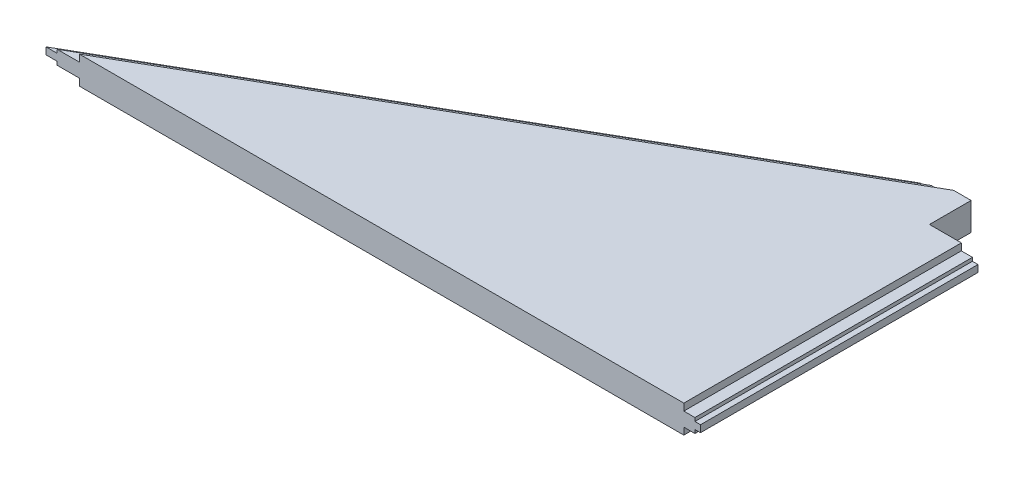
ISO-10303-21;
HEADER;
FILE_DESCRIPTION(('STEP AP214'),'2;1');
FILE_NAME('part.step','',(''),(''),'','','');
FILE_SCHEMA(('AUTOMOTIVE_DESIGN { 1 0 10303 214 1 1 1 1 }'));
ENDSEC;
DATA;
#1=APPLICATION_CONTEXT('core data for automotive mechanical design processes');
#2=APPLICATION_PROTOCOL_DEFINITION('international standard','automotive_design',2000,#1);
#3=PRODUCT_CONTEXT('',#1,'mechanical');
#4=PRODUCT('Part','Part','',(#3));
#5=PRODUCT_RELATED_PRODUCT_CATEGORY('part','',(#4));
#6=PRODUCT_DEFINITION_FORMATION('','',#4);
#7=PRODUCT_DEFINITION_CONTEXT('part definition',#1,'design');
#8=PRODUCT_DEFINITION('design','',#6,#7);
#9=PRODUCT_DEFINITION_SHAPE('','',#8);
#10=(LENGTH_UNIT() NAMED_UNIT(*) SI_UNIT(.MILLI.,.METRE.));
#11=(NAMED_UNIT(*) PLANE_ANGLE_UNIT() SI_UNIT($,.RADIAN.));
#12=(NAMED_UNIT(*) SI_UNIT($,.STERADIAN.) SOLID_ANGLE_UNIT());
#13=UNCERTAINTY_MEASURE_WITH_UNIT(LENGTH_MEASURE(1.E-05),#10,'distance_accuracy_value','');
#14=(GEOMETRIC_REPRESENTATION_CONTEXT(3) GLOBAL_UNCERTAINTY_ASSIGNED_CONTEXT((#13)) GLOBAL_UNIT_ASSIGNED_CONTEXT((#10,
#11,#12)) REPRESENTATION_CONTEXT('',''));
#15=CARTESIAN_POINT('',(0.,0.,0.));
#16=DIRECTION('',(0.,0.,1.));
#17=DIRECTION('',(1.,0.,0.));
#18=AXIS2_PLACEMENT_3D('',#15,#16,#17);
#19=CARTESIAN_POINT('',(0.,-6.35,-146.05));
#20=DIRECTION('',(0.,0.,-1.));
#21=DIRECTION('',(-1.,0.,0.));
#22=AXIS2_PLACEMENT_3D('',#19,#20,#21);
#23=PLANE('',#22);
#24=DIRECTION('',(-1.,0.,0.));
#25=VECTOR('',#24,1.);
#26=CARTESIAN_POINT('',(0.,6.35,-146.05));
#27=LINE('',#26,#25);
#28=CARTESIAN_POINT('',(-57.765000048,6.35,-146.05));
#29=VERTEX_POINT('',#28);
#30=CARTESIAN_POINT('',(-65.7751226527547,6.35,-146.05));
#31=VERTEX_POINT('',#30);
#32=EDGE_CURVE('E353',#29,#31,#27,.T.);
#33=ORIENTED_EDGE('',*,*,#32,.F.);
#34=DIRECTION('',(0.,1.,0.));
#35=VECTOR('',#34,1.);
#36=CARTESIAN_POINT('',(-57.765000048,-6.35,-146.05));
#37=LINE('',#36,#35);
#38=CARTESIAN_POINT('',(-57.765000048,-6.35,-146.05));
#39=VERTEX_POINT('',#38);
#40=EDGE_CURVE('E216',#39,#29,#37,.T.);
#41=ORIENTED_EDGE('',*,*,#40,.F.);
#42=DIRECTION('',(-1.,0.,0.));
#43=VECTOR('',#42,1.);
#44=CARTESIAN_POINT('',(0.,-6.35,-146.05));
#45=LINE('',#44,#43);
#46=CARTESIAN_POINT('',(-65.7751226527547,-6.35,-146.05));
#47=VERTEX_POINT('',#46);
#48=EDGE_CURVE('E221',#39,#47,#45,.T.);
#49=ORIENTED_EDGE('',*,*,#48,.T.);
#50=DIRECTION('',(0.,-1.,0.));
#51=VECTOR('',#50,1.);
#52=CARTESIAN_POINT('',(-65.7751226527547,-6.35,-146.05));
#53=LINE('',#52,#51);
#54=CARTESIAN_POINT('',(-65.7751226527545,-3.175,-146.05));
#55=VERTEX_POINT('',#54);
#56=EDGE_CURVE('E303',#55,#47,#53,.T.);
#57=ORIENTED_EDGE('',*,*,#56,.F.);
#58=DIRECTION('',(1.,0.,0.));
#59=VECTOR('',#58,1.);
#60=CARTESIAN_POINT('',(0.,-3.175,-146.05));
#61=LINE('',#60,#59);
#62=CARTESIAN_POINT('',(-75.9662846936072,-3.175,-146.05));
#63=VERTEX_POINT('',#62);
#64=EDGE_CURVE('E277',#63,#55,#61,.T.);
#65=ORIENTED_EDGE('',*,*,#64,.F.);
#66=DIRECTION('',(0.,1.,0.));
#67=VECTOR('',#66,1.);
#68=CARTESIAN_POINT('',(-75.9662846936071,-6.35,-146.05));
#69=LINE('',#68,#67);
#70=CARTESIAN_POINT('',(-75.9662846936073,-1.5875,-146.05));
#71=VERTEX_POINT('',#70);
#72=EDGE_CURVE('E282',#63,#71,#69,.T.);
#73=ORIENTED_EDGE('',*,*,#72,.T.);
#74=DIRECTION('',(-1.,0.,0.));
#75=VECTOR('',#74,1.);
#76=CARTESIAN_POINT('',(0.,-1.58749999999999,-146.05));
#77=LINE('',#76,#75);
#78=CARTESIAN_POINT('',(-81.0618657140334,-1.5875,-146.05));
#79=VERTEX_POINT('',#78);
#80=EDGE_CURVE('E309',#71,#79,#77,.T.);
#81=ORIENTED_EDGE('',*,*,#80,.T.);
#82=DIRECTION('',(0.,1.,0.));
#83=VECTOR('',#82,1.);
#84=CARTESIAN_POINT('',(-81.0618657140334,-6.35,-146.05));
#85=LINE('',#84,#83);
#86=CARTESIAN_POINT('',(-81.0618657140334,1.5875,-146.05));
#87=VERTEX_POINT('',#86);
#88=EDGE_CURVE('E306',#79,#87,#85,.T.);
#89=ORIENTED_EDGE('',*,*,#88,.T.);
#90=DIRECTION('',(1.,0.,0.));
#91=VECTOR('',#90,1.);
#92=CARTESIAN_POINT('',(0.,1.5875,-146.05));
#93=LINE('',#92,#91);
#94=CARTESIAN_POINT('',(-75.9662846936072,1.5875,-146.05));
#95=VERTEX_POINT('',#94);
#96=EDGE_CURVE('E312',#87,#95,#93,.T.);
#97=ORIENTED_EDGE('',*,*,#96,.T.);
#98=DIRECTION('',(0.,1.,0.));
#99=VECTOR('',#98,1.);
#100=CARTESIAN_POINT('',(-75.9662846936071,-6.35,-146.05));
#101=LINE('',#100,#99);
#102=CARTESIAN_POINT('',(-75.9662846936071,3.175,-146.05));
#103=VERTEX_POINT('',#102);
#104=EDGE_CURVE('E294',#95,#103,#101,.T.);
#105=ORIENTED_EDGE('',*,*,#104,.T.);
#106=DIRECTION('',(1.,0.,0.));
#107=VECTOR('',#106,1.);
#108=CARTESIAN_POINT('',(0.,3.175,-146.05));
#109=LINE('',#108,#107);
#110=CARTESIAN_POINT('',(-65.7751226527548,3.175,-146.05));
#111=VERTEX_POINT('',#110);
#112=EDGE_CURVE('E288',#103,#111,#109,.T.);
#113=ORIENTED_EDGE('',*,*,#112,.T.);
#114=DIRECTION('',(0.,1.,0.));
#115=VECTOR('',#114,1.);
#116=CARTESIAN_POINT('',(-65.7751226527547,-6.35,-146.05));
#117=LINE('',#116,#115);
#118=EDGE_CURVE('E298',#111,#31,#117,.T.);
#119=ORIENTED_EDGE('',*,*,#118,.T.);
#120=EDGE_LOOP('',(#33,#41,#49,#57,#65,#73,#81,#89,#97,#105,#113,#119));
#121=FACE_BOUND('',#120,.T.);
#122=ADVANCED_FACE('F49',(#121),#23,.T.);
#123=CARTESIAN_POINT('',(0.,6.35,0.));
#124=DIRECTION('',(0.,-1.,0.));
#125=DIRECTION('',(0.,0.,-1.));
#126=AXIS2_PLACEMENT_3D('',#123,#124,#125);
#127=PLANE('',#126);
#128=DIRECTION('',(0.,0.,-1.));
#129=VECTOR('',#128,1.);
#130=CARTESIAN_POINT('',(-57.765000048,6.35,0.));
#131=LINE('',#130,#129);
#132=CARTESIAN_POINT('',(-57.765000048,6.35,-127.));
#133=VERTEX_POINT('',#132);
#134=EDGE_CURVE('E215',#133,#29,#131,.T.);
#135=ORIENTED_EDGE('',*,*,#134,.T.);
#136=ORIENTED_EDGE('',*,*,#32,.T.);
#137=DIRECTION('',(0.866906303057535,0.,-0.498471124258082));
#138=VECTOR('',#137,1.);
#139=CARTESIAN_POINT('',(-424.945372258804,6.35,60.4728935234783));
#140=LINE('',#139,#138);
#141=CARTESIAN_POINT('',(-319.775122652755,6.35,0.));
#142=VERTEX_POINT('',#141);
#143=EDGE_CURVE('E264',#142,#31,#140,.T.);
#144=ORIENTED_EDGE('',*,*,#143,.F.);
#145=DIRECTION('',(1.,0.,0.));
#146=VECTOR('',#145,1.);
#147=CARTESIAN_POINT('',(-406.4,6.35,0.));
#148=LINE('',#147,#146);
#149=CARTESIAN_POINT('',(-43.18,6.35,0.));
#150=VERTEX_POINT('',#149);
#151=EDGE_CURVE('E357',#142,#150,#148,.T.);
#152=ORIENTED_EDGE('',*,*,#151,.T.);
#153=DIRECTION('',(0.,0.,-1.));
#154=VECTOR('',#153,1.);
#155=CARTESIAN_POINT('',(-43.1799999999999,6.35,11.0490000000001));
#156=LINE('',#155,#154);
#157=CARTESIAN_POINT('',(-43.18,6.35,-127.));
#158=VERTEX_POINT('',#157);
#159=EDGE_CURVE('E333',#150,#158,#156,.T.);
#160=ORIENTED_EDGE('',*,*,#159,.T.);
#161=DIRECTION('',(1.,0.,0.));
#162=VECTOR('',#161,1.);
#163=CARTESIAN_POINT('',(-50.8,6.35,-127.));
#164=LINE('',#163,#162);
#165=EDGE_CURVE('E225',#133,#158,#164,.T.);
#166=ORIENTED_EDGE('',*,*,#165,.F.);
#167=EDGE_LOOP('',(#135,#136,#144,#152,#160,#166));
#168=FACE_BOUND('',#167,.T.);
#169=ADVANCED_FACE('F443',(#168),#127,.F.);
#170=CARTESIAN_POINT('',(0.,-6.35,0.));
#171=DIRECTION('',(0.,-1.,0.));
#172=DIRECTION('',(0.,0.,-1.));
#173=AXIS2_PLACEMENT_3D('',#170,#171,#172);
#174=PLANE('',#173);
#175=ORIENTED_EDGE('',*,*,#48,.F.);
#176=DIRECTION('',(0.,0.,-1.));
#177=VECTOR('',#176,1.);
#178=CARTESIAN_POINT('',(-57.765000048,-6.35,0.));
#179=LINE('',#178,#177);
#180=CARTESIAN_POINT('',(-57.765000048,-6.35,-127.));
#181=VERTEX_POINT('',#180);
#182=EDGE_CURVE('E212',#181,#39,#179,.T.);
#183=ORIENTED_EDGE('',*,*,#182,.F.);
#184=DIRECTION('',(-1.,0.,0.));
#185=VECTOR('',#184,1.);
#186=CARTESIAN_POINT('',(0.,-6.35,-127.));
#187=LINE('',#186,#185);
#188=CARTESIAN_POINT('',(-43.18,-6.35,-127.));
#189=VERTEX_POINT('',#188);
#190=EDGE_CURVE('E197',#189,#181,#187,.T.);
#191=ORIENTED_EDGE('',*,*,#190,.F.);
#192=DIRECTION('',(0.,0.,-1.));
#193=VECTOR('',#192,1.);
#194=CARTESIAN_POINT('',(-43.1799999999999,-6.35,11.0490000000001));
#195=LINE('',#194,#193);
#196=CARTESIAN_POINT('',(-43.18,-6.35,0.));
#197=VERTEX_POINT('',#196);
#198=EDGE_CURVE('E340',#197,#189,#195,.T.);
#199=ORIENTED_EDGE('',*,*,#198,.F.);
#200=DIRECTION('',(1.,0.,0.));
#201=VECTOR('',#200,1.);
#202=CARTESIAN_POINT('',(-406.4,-6.35,0.));
#203=LINE('',#202,#201);
#204=CARTESIAN_POINT('',(-319.775122652755,-6.35,0.));
#205=VERTEX_POINT('',#204);
#206=EDGE_CURVE('E360',#205,#197,#203,.T.);
#207=ORIENTED_EDGE('',*,*,#206,.F.);
#208=DIRECTION('',(0.866906303057535,0.,-0.498471124258082));
#209=VECTOR('',#208,1.);
#210=CARTESIAN_POINT('',(-424.945372258804,-6.35,60.4728935234783));
#211=LINE('',#210,#209);
#212=EDGE_CURVE('E262',#205,#47,#211,.T.);
#213=ORIENTED_EDGE('',*,*,#212,.T.);
#214=EDGE_LOOP('',(#175,#183,#191,#199,#207,#213));
#215=FACE_BOUND('',#214,.T.);
#216=ADVANCED_FACE('F219',(#215),#174,.T.);
#217=CARTESIAN_POINT('',(-406.4,-6.35,0.));
#218=DIRECTION('',(0.,0.,1.));
#219=DIRECTION('',(1.,0.,0.));
#220=AXIS2_PLACEMENT_3D('',#217,#218,#219);
#221=PLANE('',#220);
#222=ORIENTED_EDGE('',*,*,#151,.F.);
#223=DIRECTION('',(0.,-1.,0.));
#224=VECTOR('',#223,1.);
#225=CARTESIAN_POINT('',(-319.775122652755,-6.35,0.));
#226=LINE('',#225,#224);
#227=CARTESIAN_POINT('',(-319.775122652755,3.175,0.));
#228=VERTEX_POINT('',#227);
#229=EDGE_CURVE('E70',#142,#228,#226,.T.);
#230=ORIENTED_EDGE('',*,*,#229,.T.);
#231=DIRECTION('',(-1.,0.,0.));
#232=VECTOR('',#231,1.);
#233=CARTESIAN_POINT('',(-406.4,3.175,0.));
#234=LINE('',#233,#232);
#235=CARTESIAN_POINT('',(-329.966284693607,3.175,0.));
#236=VERTEX_POINT('',#235);
#237=EDGE_CURVE('E285',#228,#236,#234,.T.);
#238=ORIENTED_EDGE('',*,*,#237,.T.);
#239=DIRECTION('',(0.,-1.,0.));
#240=VECTOR('',#239,1.);
#241=CARTESIAN_POINT('',(-329.966284693607,-6.35,0.));
#242=LINE('',#241,#240);
#243=CARTESIAN_POINT('',(-329.966284693607,1.5875,0.));
#244=VERTEX_POINT('',#243);
#245=EDGE_CURVE('E291',#236,#244,#242,.T.);
#246=ORIENTED_EDGE('',*,*,#245,.T.);
#247=DIRECTION('',(-1.,0.,0.));
#248=VECTOR('',#247,1.);
#249=CARTESIAN_POINT('',(-406.4,1.5875,0.));
#250=LINE('',#249,#248);
#251=CARTESIAN_POINT('',(-335.061865714034,1.5875,0.));
#252=VERTEX_POINT('',#251);
#253=EDGE_CURVE('E56',#244,#252,#250,.T.);
#254=ORIENTED_EDGE('',*,*,#253,.T.);
#255=DIRECTION('',(0.,-1.,0.));
#256=VECTOR('',#255,1.);
#257=CARTESIAN_POINT('',(-335.061865714034,-6.35,0.));
#258=LINE('',#257,#256);
#259=CARTESIAN_POINT('',(-335.061865714034,-1.5875,0.));
#260=VERTEX_POINT('',#259);
#261=EDGE_CURVE('E373',#252,#260,#258,.T.);
#262=ORIENTED_EDGE('',*,*,#261,.T.);
#263=DIRECTION('',(1.,0.,0.));
#264=VECTOR('',#263,1.);
#265=CARTESIAN_POINT('',(-406.4,-1.58750000000001,0.));
#266=LINE('',#265,#264);
#267=CARTESIAN_POINT('',(-329.966284693607,-1.5875,0.));
#268=VERTEX_POINT('',#267);
#269=EDGE_CURVE('E376',#260,#268,#266,.T.);
#270=ORIENTED_EDGE('',*,*,#269,.T.);
#271=DIRECTION('',(0.,-1.,0.));
#272=VECTOR('',#271,1.);
#273=CARTESIAN_POINT('',(-329.966284693607,-6.35,0.));
#274=LINE('',#273,#272);
#275=CARTESIAN_POINT('',(-329.966284693607,-3.175,0.));
#276=VERTEX_POINT('',#275);
#277=EDGE_CURVE('E279',#268,#276,#274,.T.);
#278=ORIENTED_EDGE('',*,*,#277,.T.);
#279=DIRECTION('',(-1.,0.,0.));
#280=VECTOR('',#279,1.);
#281=CARTESIAN_POINT('',(-406.4,-3.175,0.));
#282=LINE('',#281,#280);
#283=CARTESIAN_POINT('',(-319.775122652755,-3.175,0.));
#284=VERTEX_POINT('',#283);
#285=EDGE_CURVE('E275',#284,#276,#282,.T.);
#286=ORIENTED_EDGE('',*,*,#285,.F.);
#287=DIRECTION('',(0.,1.,0.));
#288=VECTOR('',#287,1.);
#289=CARTESIAN_POINT('',(-319.775122652755,-6.35,0.));
#290=LINE('',#289,#288);
#291=EDGE_CURVE('E301',#205,#284,#290,.T.);
#292=ORIENTED_EDGE('',*,*,#291,.F.);
#293=ORIENTED_EDGE('',*,*,#206,.T.);
#294=DIRECTION('',(0.,1.,0.));
#295=VECTOR('',#294,1.);
#296=CARTESIAN_POINT('',(-43.1799999999999,-6.35,0.));
#297=LINE('',#296,#295);
#298=CARTESIAN_POINT('',(-43.18,-3.175,0.));
#299=VERTEX_POINT('',#298);
#300=EDGE_CURVE('E346',#197,#299,#297,.T.);
#301=ORIENTED_EDGE('',*,*,#300,.T.);
#302=DIRECTION('',(1.,0.,0.));
#303=VECTOR('',#302,1.);
#304=CARTESIAN_POINT('',(-38.1,-3.175,0.));
#305=LINE('',#304,#303);
#306=CARTESIAN_POINT('',(-38.1,-3.175,0.));
#307=VERTEX_POINT('',#306);
#308=EDGE_CURVE('E349',#299,#307,#305,.T.);
#309=ORIENTED_EDGE('',*,*,#308,.T.);
#310=DIRECTION('',(0.,-1.,0.));
#311=VECTOR('',#310,1.);
#312=CARTESIAN_POINT('',(-38.1,-6.35000000000322,0.));
#313=LINE('',#312,#311);
#314=CARTESIAN_POINT('',(-38.0999999999999,-1.5875,0.));
#315=VERTEX_POINT('',#314);
#316=EDGE_CURVE('E319',#315,#307,#313,.T.);
#317=ORIENTED_EDGE('',*,*,#316,.F.);
#318=DIRECTION('',(-1.,0.,0.));
#319=VECTOR('',#318,1.);
#320=CARTESIAN_POINT('',(-406.4,-1.58749999999997,0.));
#321=LINE('',#320,#319);
#322=CARTESIAN_POINT('',(-35.5599999999999,-1.5875,0.));
#323=VERTEX_POINT('',#322);
#324=EDGE_CURVE('E371',#323,#315,#321,.T.);
#325=ORIENTED_EDGE('',*,*,#324,.F.);
#326=DIRECTION('',(0.,-1.,0.));
#327=VECTOR('',#326,1.);
#328=CARTESIAN_POINT('',(-35.5599999999999,-6.35,0.));
#329=LINE('',#328,#327);
#330=CARTESIAN_POINT('',(-35.5599999999999,1.5875,0.));
#331=VERTEX_POINT('',#330);
#332=EDGE_CURVE('E369',#331,#323,#329,.T.);
#333=ORIENTED_EDGE('',*,*,#332,.F.);
#334=DIRECTION('',(1.,0.,0.));
#335=VECTOR('',#334,1.);
#336=CARTESIAN_POINT('',(-406.4,1.5875,0.));
#337=LINE('',#336,#335);
#338=CARTESIAN_POINT('',(-38.0999999999999,1.5875,0.));
#339=VERTEX_POINT('',#338);
#340=EDGE_CURVE('E367',#339,#331,#337,.T.);
#341=ORIENTED_EDGE('',*,*,#340,.F.);
#342=DIRECTION('',(0.,-1.,0.));
#343=VECTOR('',#342,1.);
#344=CARTESIAN_POINT('',(-38.0999999999999,-6.34999999999678,0.));
#345=LINE('',#344,#343);
#346=CARTESIAN_POINT('',(-38.1,3.175,0.));
#347=VERTEX_POINT('',#346);
#348=EDGE_CURVE('E330',#347,#339,#345,.T.);
#349=ORIENTED_EDGE('',*,*,#348,.F.);
#350=DIRECTION('',(1.,0.,0.));
#351=VECTOR('',#350,1.);
#352=CARTESIAN_POINT('',(-38.1,3.175,0.));
#353=LINE('',#352,#351);
#354=CARTESIAN_POINT('',(-43.18,3.175,0.));
#355=VERTEX_POINT('',#354);
#356=EDGE_CURVE('E350',#355,#347,#353,.T.);
#357=ORIENTED_EDGE('',*,*,#356,.F.);
#358=DIRECTION('',(0.,-1.,0.));
#359=VECTOR('',#358,1.);
#360=CARTESIAN_POINT('',(-43.1799999999999,-6.35,0.));
#361=LINE('',#360,#359);
#362=EDGE_CURVE('E336',#150,#355,#361,.T.);
#363=ORIENTED_EDGE('',*,*,#362,.F.);
#364=EDGE_LOOP('',(#222,#230,#238,#246,#254,#262,#270,#278,#286,#292,#293,#301,#309,#317,#325,
#333,#341,#349,#357,#363));
#365=FACE_BOUND('',#364,.T.);
#366=ADVANCED_FACE('F381',(#365),#221,.T.);
#367=CARTESIAN_POINT('',(-38.1,3.175,0.));
#368=DIRECTION('',(0.,-1.,0.));
#369=DIRECTION('',(0.,0.,-1.));
#370=AXIS2_PLACEMENT_3D('',#367,#368,#369);
#371=PLANE('',#370);
#372=DIRECTION('',(0.,0.,-1.));
#373=VECTOR('',#372,1.);
#374=CARTESIAN_POINT('',(-38.1,3.175,0.));
#375=LINE('',#374,#373);
#376=CARTESIAN_POINT('',(-38.1,3.175,-127.));
#377=VERTEX_POINT('',#376);
#378=EDGE_CURVE('E364',#347,#377,#375,.T.);
#379=ORIENTED_EDGE('',*,*,#378,.T.);
#380=DIRECTION('',(-1.,0.,0.));
#381=VECTOR('',#380,1.);
#382=CARTESIAN_POINT('',(-38.1,3.175,-127.));
#383=LINE('',#382,#381);
#384=CARTESIAN_POINT('',(-43.18,3.175,-127.));
#385=VERTEX_POINT('',#384);
#386=EDGE_CURVE('E63',#377,#385,#383,.T.);
#387=ORIENTED_EDGE('',*,*,#386,.T.);
#388=DIRECTION('',(0.,0.,-1.));
#389=VECTOR('',#388,1.);
#390=CARTESIAN_POINT('',(-43.1799999999999,3.175,11.0490000000001));
#391=LINE('',#390,#389);
#392=EDGE_CURVE('E337',#355,#385,#391,.T.);
#393=ORIENTED_EDGE('',*,*,#392,.F.);
#394=ORIENTED_EDGE('',*,*,#356,.T.);
#395=EDGE_LOOP('',(#379,#387,#393,#394));
#396=FACE_BOUND('',#395,.T.);
#397=ADVANCED_FACE('F438',(#396),#371,.F.);
#398=CARTESIAN_POINT('',(-38.1,-3.175,0.));
#399=DIRECTION('',(0.,1.,0.));
#400=DIRECTION('',(0.,0.,1.));
#401=AXIS2_PLACEMENT_3D('',#398,#399,#400);
#402=PLANE('',#401);
#403=DIRECTION('',(0.,0.,-1.));
#404=VECTOR('',#403,1.);
#405=CARTESIAN_POINT('',(-43.1799999999999,-3.175,11.0490000000001));
#406=LINE('',#405,#404);
#407=CARTESIAN_POINT('',(-43.18,-3.175,-127.));
#408=VERTEX_POINT('',#407);
#409=EDGE_CURVE('E332',#299,#408,#406,.T.);
#410=ORIENTED_EDGE('',*,*,#409,.T.);
#411=DIRECTION('',(1.,0.,0.));
#412=VECTOR('',#411,1.);
#413=CARTESIAN_POINT('',(-38.1,-3.175,-127.));
#414=LINE('',#413,#412);
#415=CARTESIAN_POINT('',(-38.1,-3.175,-127.));
#416=VERTEX_POINT('',#415);
#417=EDGE_CURVE('E244',#408,#416,#414,.T.);
#418=ORIENTED_EDGE('',*,*,#417,.T.);
#419=DIRECTION('',(0.,0.,1.));
#420=VECTOR('',#419,1.);
#421=CARTESIAN_POINT('',(-38.1,-3.175,0.));
#422=LINE('',#421,#420);
#423=EDGE_CURVE('E362',#416,#307,#422,.T.);
#424=ORIENTED_EDGE('',*,*,#423,.T.);
#425=ORIENTED_EDGE('',*,*,#308,.F.);
#426=EDGE_LOOP('',(#410,#418,#424,#425));
#427=FACE_BOUND('',#426,.T.);
#428=ADVANCED_FACE('F416',(#427),#402,.F.);
#429=CARTESIAN_POINT('',(-43.1799999999999,0.,11.0490000000001));
#430=DIRECTION('',(1.,0.,0.));
#431=DIRECTION('',(0.,0.,-1.));
#432=AXIS2_PLACEMENT_3D('',#429,#430,#431);
#433=PLANE('',#432);
#434=DIRECTION('',(0.,-1.,0.));
#435=VECTOR('',#434,1.);
#436=CARTESIAN_POINT('',(-43.18,0.,-127.));
#437=LINE('',#436,#435);
#438=EDGE_CURVE('E203',#408,#189,#437,.T.);
#439=ORIENTED_EDGE('',*,*,#438,.F.);
#440=ORIENTED_EDGE('',*,*,#409,.F.);
#441=ORIENTED_EDGE('',*,*,#300,.F.);
#442=ORIENTED_EDGE('',*,*,#198,.T.);
#443=EDGE_LOOP('',(#439,#440,#441,#442));
#444=FACE_BOUND('',#443,.T.);
#445=ADVANCED_FACE('F411',(#444),#433,.T.);
#446=CARTESIAN_POINT('',(-43.1799999999999,0.,11.0490000000001));
#447=DIRECTION('',(-1.,0.,0.));
#448=DIRECTION('',(0.,0.,1.));
#449=AXIS2_PLACEMENT_3D('',#446,#447,#448);
#450=PLANE('',#449);
#451=ORIENTED_EDGE('',*,*,#392,.T.);
#452=DIRECTION('',(0.,1.,0.));
#453=VECTOR('',#452,1.);
#454=CARTESIAN_POINT('',(-43.18,0.,-127.));
#455=LINE('',#454,#453);
#456=EDGE_CURVE('E235',#385,#158,#455,.T.);
#457=ORIENTED_EDGE('',*,*,#456,.T.);
#458=ORIENTED_EDGE('',*,*,#159,.F.);
#459=ORIENTED_EDGE('',*,*,#362,.T.);
#460=EDGE_LOOP('',(#451,#457,#458,#459));
#461=FACE_BOUND('',#460,.T.);
#462=ADVANCED_FACE('F440',(#461),#450,.F.);
#463=CARTESIAN_POINT('',(0.,1.5875,11.0490000000001));
#464=DIRECTION('',(0.,-1.,0.));
#465=DIRECTION('',(0.,0.,-1.));
#466=AXIS2_PLACEMENT_3D('',#463,#464,#465);
#467=PLANE('',#466);
#468=DIRECTION('',(0.,0.,-1.));
#469=VECTOR('',#468,1.);
#470=CARTESIAN_POINT('',(-35.5599999999999,1.5875,11.0490000000001));
#471=LINE('',#470,#469);
#472=CARTESIAN_POINT('',(-35.5599999999999,1.5875,-127.));
#473=VERTEX_POINT('',#472);
#474=EDGE_CURVE('E316',#331,#473,#471,.T.);
#475=ORIENTED_EDGE('',*,*,#474,.T.);
#476=DIRECTION('',(-1.,0.,0.));
#477=VECTOR('',#476,1.);
#478=CARTESIAN_POINT('',(0.,1.5875,-127.));
#479=LINE('',#478,#477);
#480=CARTESIAN_POINT('',(-38.1,1.5875,-127.));
#481=VERTEX_POINT('',#480);
#482=EDGE_CURVE('E228',#473,#481,#479,.T.);
#483=ORIENTED_EDGE('',*,*,#482,.T.);
#484=DIRECTION('',(0.,0.,-1.));
#485=VECTOR('',#484,1.);
#486=CARTESIAN_POINT('',(-38.0999999999999,1.5875,11.0490000000001));
#487=LINE('',#486,#485);
#488=EDGE_CURVE('E315',#339,#481,#487,.T.);
#489=ORIENTED_EDGE('',*,*,#488,.F.);
#490=ORIENTED_EDGE('',*,*,#340,.T.);
#491=EDGE_LOOP('',(#475,#483,#489,#490));
#492=FACE_BOUND('',#491,.T.);
#493=ADVANCED_FACE('F431',(#492),#467,.F.);
#494=CARTESIAN_POINT('',(-35.5599999999999,0.,11.0490000000001));
#495=DIRECTION('',(-1.,0.,0.));
#496=DIRECTION('',(0.,0.,1.));
#497=AXIS2_PLACEMENT_3D('',#494,#495,#496);
#498=PLANE('',#497);
#499=DIRECTION('',(0.,0.,-1.));
#500=VECTOR('',#499,1.);
#501=CARTESIAN_POINT('',(-35.5599999999999,-1.5875,11.0490000000001));
#502=LINE('',#501,#500);
#503=CARTESIAN_POINT('',(-35.56,-1.5875,-127.));
#504=VERTEX_POINT('',#503);
#505=EDGE_CURVE('E320',#323,#504,#502,.T.);
#506=ORIENTED_EDGE('',*,*,#505,.T.);
#507=DIRECTION('',(0.,1.,0.));
#508=VECTOR('',#507,1.);
#509=CARTESIAN_POINT('',(-35.56,0.,-127.));
#510=LINE('',#509,#508);
#511=EDGE_CURVE('E232',#504,#473,#510,.T.);
#512=ORIENTED_EDGE('',*,*,#511,.T.);
#513=ORIENTED_EDGE('',*,*,#474,.F.);
#514=ORIENTED_EDGE('',*,*,#332,.T.);
#515=EDGE_LOOP('',(#506,#512,#513,#514));
#516=FACE_BOUND('',#515,.T.);
#517=ADVANCED_FACE('F429',(#516),#498,.F.);
#518=CARTESIAN_POINT('',(0.,-1.5875,11.0490000000001));
#519=DIRECTION('',(0.,1.,0.));
#520=DIRECTION('',(-1.,0.,0.));
#521=AXIS2_PLACEMENT_3D('',#518,#519,#520);
#522=PLANE('',#521);
#523=DIRECTION('',(0.,0.,-1.));
#524=VECTOR('',#523,1.);
#525=CARTESIAN_POINT('',(-38.0999999999999,-1.5875,11.0490000000001));
#526=LINE('',#525,#524);
#527=CARTESIAN_POINT('',(-38.1,-1.5875,-127.));
#528=VERTEX_POINT('',#527);
#529=EDGE_CURVE('E323',#315,#528,#526,.T.);
#530=ORIENTED_EDGE('',*,*,#529,.T.);
#531=DIRECTION('',(1.,0.,0.));
#532=VECTOR('',#531,1.);
#533=CARTESIAN_POINT('',(0.,-1.5875,-127.));
#534=LINE('',#533,#532);
#535=EDGE_CURVE('E238',#528,#504,#534,.T.);
#536=ORIENTED_EDGE('',*,*,#535,.T.);
#537=ORIENTED_EDGE('',*,*,#505,.F.);
#538=ORIENTED_EDGE('',*,*,#324,.T.);
#539=EDGE_LOOP('',(#530,#536,#537,#538));
#540=FACE_BOUND('',#539,.T.);
#541=ADVANCED_FACE('F422',(#540),#522,.F.);
#542=CARTESIAN_POINT('',(-38.0999999999999,3.33066907387546E-13,11.0490000000001));
#543=DIRECTION('',(-1.,0.,0.));
#544=DIRECTION('',(0.,-1.,0.));
#545=AXIS2_PLACEMENT_3D('',#542,#543,#544);
#546=PLANE('',#545);
#547=ORIENTED_EDGE('',*,*,#423,.F.);
#548=DIRECTION('',(0.,1.,0.));
#549=VECTOR('',#548,1.);
#550=CARTESIAN_POINT('',(-38.1,3.33066907387547E-13,-127.));
#551=LINE('',#550,#549);
#552=EDGE_CURVE('E241',#416,#528,#551,.T.);
#553=ORIENTED_EDGE('',*,*,#552,.T.);
#554=ORIENTED_EDGE('',*,*,#529,.F.);
#555=ORIENTED_EDGE('',*,*,#316,.T.);
#556=EDGE_LOOP('',(#547,#553,#554,#555));
#557=FACE_BOUND('',#556,.T.);
#558=ADVANCED_FACE('F420',(#557),#546,.F.);
#559=CARTESIAN_POINT('',(-38.0999999999999,-3.33066907387546E-13,11.0490000000001));
#560=DIRECTION('',(-1.,0.,0.));
#561=DIRECTION('',(0.,-1.,0.));
#562=AXIS2_PLACEMENT_3D('',#559,#560,#561);
#563=PLANE('',#562);
#564=ORIENTED_EDGE('',*,*,#488,.T.);
#565=DIRECTION('',(0.,1.,0.));
#566=VECTOR('',#565,1.);
#567=CARTESIAN_POINT('',(-38.1,-3.33066907387547E-13,-127.));
#568=LINE('',#567,#566);
#569=EDGE_CURVE('E11',#481,#377,#568,.T.);
#570=ORIENTED_EDGE('',*,*,#569,.T.);
#571=ORIENTED_EDGE('',*,*,#378,.F.);
#572=ORIENTED_EDGE('',*,*,#348,.T.);
#573=EDGE_LOOP('',(#564,#570,#571,#572));
#574=FACE_BOUND('',#573,.T.);
#575=ADVANCED_FACE('F434',(#574),#563,.F.);
#576=CARTESIAN_POINT('',(-345.489740561619,1.5875,198.656600822931));
#577=DIRECTION('',(0.,1.,0.));
#578=DIRECTION('',(0.,0.,1.));
#579=AXIS2_PLACEMENT_3D('',#576,#577,#578);
#580=PLANE('',#579);
#581=DIRECTION('',(0.866906303057535,0.,-0.498471124258082));
#582=VECTOR('',#581,1.);
#583=CARTESIAN_POINT('',(-428.743722225651,1.5875,53.8670674941799));
#584=LINE('',#583,#582);
#585=EDGE_CURVE('E208',#252,#87,#584,.T.);
#586=ORIENTED_EDGE('',*,*,#585,.F.);
#587=ORIENTED_EDGE('',*,*,#253,.F.);
#588=DIRECTION('',(0.866906303057535,0.,-0.498471124258082));
#589=VECTOR('',#588,1.);
#590=CARTESIAN_POINT('',(-427.477605570035,1.5875,56.069009503946));
#591=LINE('',#590,#589);
#592=EDGE_CURVE('E272',#244,#95,#591,.T.);
#593=ORIENTED_EDGE('',*,*,#592,.T.);
#594=ORIENTED_EDGE('',*,*,#96,.F.);
#595=EDGE_LOOP('',(#586,#587,#593,#594));
#596=FACE_BOUND('',#595,.T.);
#597=ADVANCED_FACE('F385',(#596),#580,.T.);
#598=CARTESIAN_POINT('',(-427.477605570035,0.,56.069009503946));
#599=DIRECTION('',(-0.498471124258082,0.,-0.866906303057535));
#600=DIRECTION('',(-0.866906303057535,0.,0.498471124258082));
#601=AXIS2_PLACEMENT_3D('',#598,#599,#600);
#602=PLANE('',#601);
#603=ORIENTED_EDGE('',*,*,#592,.F.);
#604=ORIENTED_EDGE('',*,*,#245,.F.);
#605=DIRECTION('',(0.866906303057535,0.,-0.498471124258082));
#606=VECTOR('',#605,1.);
#607=CARTESIAN_POINT('',(-427.477605570035,3.175,56.069009503946));
#608=LINE('',#607,#606);
#609=EDGE_CURVE('E269',#236,#103,#608,.T.);
#610=ORIENTED_EDGE('',*,*,#609,.T.);
#611=ORIENTED_EDGE('',*,*,#104,.F.);
#612=EDGE_LOOP('',(#603,#604,#610,#611));
#613=FACE_BOUND('',#612,.T.);
#614=ADVANCED_FACE('F387',(#613),#602,.T.);
#615=CARTESIAN_POINT('',(-345.489740561619,3.175,198.656600822931));
#616=DIRECTION('',(0.,1.,0.));
#617=DIRECTION('',(0.,0.,1.));
#618=AXIS2_PLACEMENT_3D('',#615,#616,#617);
#619=PLANE('',#618);
#620=ORIENTED_EDGE('',*,*,#609,.F.);
#621=ORIENTED_EDGE('',*,*,#237,.F.);
#622=DIRECTION('',(0.866906303057535,0.,-0.498471124258082));
#623=VECTOR('',#622,1.);
#624=CARTESIAN_POINT('',(-424.945372258804,3.175,60.4728935234783));
#625=LINE('',#624,#623);
#626=EDGE_CURVE('E266',#228,#111,#625,.T.);
#627=ORIENTED_EDGE('',*,*,#626,.T.);
#628=ORIENTED_EDGE('',*,*,#112,.F.);
#629=EDGE_LOOP('',(#620,#621,#627,#628));
#630=FACE_BOUND('',#629,.T.);
#631=ADVANCED_FACE('F453',(#630),#619,.T.);
#632=CARTESIAN_POINT('',(-424.945372258804,0.,60.4728935234783));
#633=DIRECTION('',(-0.498471124258082,0.,-0.866906303057535));
#634=DIRECTION('',(-0.866906303057535,0.,0.498471124258082));
#635=AXIS2_PLACEMENT_3D('',#632,#633,#634);
#636=PLANE('',#635);
#637=ORIENTED_EDGE('',*,*,#626,.F.);
#638=ORIENTED_EDGE('',*,*,#229,.F.);
#639=ORIENTED_EDGE('',*,*,#143,.T.);
#640=ORIENTED_EDGE('',*,*,#118,.F.);
#641=EDGE_LOOP('',(#637,#638,#639,#640));
#642=FACE_BOUND('',#641,.T.);
#643=ADVANCED_FACE('F444',(#642),#636,.T.);
#644=CARTESIAN_POINT('',(-424.945372258804,0.,60.4728935234783));
#645=DIRECTION('',(0.498471124258082,0.,0.866906303057535));
#646=DIRECTION('',(0.866906303057535,0.,-0.498471124258082));
#647=AXIS2_PLACEMENT_3D('',#644,#645,#646);
#648=PLANE('',#647);
#649=ORIENTED_EDGE('',*,*,#56,.T.);
#650=ORIENTED_EDGE('',*,*,#212,.F.);
#651=ORIENTED_EDGE('',*,*,#291,.T.);
#652=DIRECTION('',(0.866906303057535,0.,-0.498471124258082));
#653=VECTOR('',#652,1.);
#654=CARTESIAN_POINT('',(-424.945372258804,-3.175,60.4728935234783));
#655=LINE('',#654,#653);
#656=EDGE_CURVE('E259',#284,#55,#655,.T.);
#657=ORIENTED_EDGE('',*,*,#656,.T.);
#658=EDGE_LOOP('',(#649,#650,#651,#657));
#659=FACE_BOUND('',#658,.T.);
#660=ADVANCED_FACE('F445',(#659),#648,.F.);
#661=CARTESIAN_POINT('',(-345.489740561619,-3.17500000000001,198.656600822931));
#662=DIRECTION('',(0.,1.,0.));
#663=DIRECTION('',(0.,0.,1.));
#664=AXIS2_PLACEMENT_3D('',#661,#662,#663);
#665=PLANE('',#664);
#666=ORIENTED_EDGE('',*,*,#64,.T.);
#667=ORIENTED_EDGE('',*,*,#656,.F.);
#668=ORIENTED_EDGE('',*,*,#285,.T.);
#669=DIRECTION('',(0.866906303057535,0.,-0.498471124258082));
#670=VECTOR('',#669,1.);
#671=CARTESIAN_POINT('',(-427.477605570035,-3.175,56.069009503946));
#672=LINE('',#671,#670);
#673=EDGE_CURVE('E256',#276,#63,#672,.T.);
#674=ORIENTED_EDGE('',*,*,#673,.T.);
#675=EDGE_LOOP('',(#666,#667,#668,#674));
#676=FACE_BOUND('',#675,.T.);
#677=ADVANCED_FACE('F403',(#676),#665,.F.);
#678=CARTESIAN_POINT('',(-427.477605570035,0.,56.069009503946));
#679=DIRECTION('',(-0.498471124258082,0.,-0.866906303057535));
#680=DIRECTION('',(-0.866906303057535,0.,0.498471124258082));
#681=AXIS2_PLACEMENT_3D('',#678,#679,#680);
#682=PLANE('',#681);
#683=ORIENTED_EDGE('',*,*,#673,.F.);
#684=ORIENTED_EDGE('',*,*,#277,.F.);
#685=DIRECTION('',(0.866906303057535,0.,-0.498471124258082));
#686=VECTOR('',#685,1.);
#687=CARTESIAN_POINT('',(-427.477605570035,-1.5875,56.069009503946));
#688=LINE('',#687,#686);
#689=EDGE_CURVE('E253',#268,#71,#688,.T.);
#690=ORIENTED_EDGE('',*,*,#689,.T.);
#691=ORIENTED_EDGE('',*,*,#72,.F.);
#692=EDGE_LOOP('',(#683,#684,#690,#691));
#693=FACE_BOUND('',#692,.T.);
#694=ADVANCED_FACE('F401',(#693),#682,.T.);
#695=CARTESIAN_POINT('',(-345.489740561619,-1.58749999999997,198.656600822931));
#696=DIRECTION('',(0.,-1.,0.));
#697=DIRECTION('',(0.,0.,-1.));
#698=AXIS2_PLACEMENT_3D('',#695,#696,#697);
#699=PLANE('',#698);
#700=ORIENTED_EDGE('',*,*,#689,.F.);
#701=ORIENTED_EDGE('',*,*,#269,.F.);
#702=DIRECTION('',(0.866906303057535,0.,-0.498471124258082));
#703=VECTOR('',#702,1.);
#704=CARTESIAN_POINT('',(-428.743722225651,-1.5875,53.8670674941799));
#705=LINE('',#704,#703);
#706=EDGE_CURVE('E250',#260,#79,#705,.T.);
#707=ORIENTED_EDGE('',*,*,#706,.T.);
#708=ORIENTED_EDGE('',*,*,#80,.F.);
#709=EDGE_LOOP('',(#700,#701,#707,#708));
#710=FACE_BOUND('',#709,.T.);
#711=ADVANCED_FACE('F396',(#710),#699,.T.);
#712=CARTESIAN_POINT('',(-428.743722225651,0.,53.8670674941799));
#713=DIRECTION('',(-0.498471124258082,0.,-0.866906303057535));
#714=DIRECTION('',(-0.866906303057535,0.,0.498471124258082));
#715=AXIS2_PLACEMENT_3D('',#712,#713,#714);
#716=PLANE('',#715);
#717=ORIENTED_EDGE('',*,*,#706,.F.);
#718=ORIENTED_EDGE('',*,*,#261,.F.);
#719=ORIENTED_EDGE('',*,*,#585,.T.);
#720=ORIENTED_EDGE('',*,*,#88,.F.);
#721=EDGE_LOOP('',(#717,#718,#719,#720));
#722=FACE_BOUND('',#721,.T.);
#723=ADVANCED_FACE('F393',(#722),#716,.T.);
#724=CARTESIAN_POINT('',(-50.8,-15.24,-127.));
#725=DIRECTION('',(0.,0.,1.));
#726=DIRECTION('',(1.,0.,0.));
#727=AXIS2_PLACEMENT_3D('',#724,#725,#726);
#728=PLANE('',#727);
#729=ORIENTED_EDGE('',*,*,#190,.T.);
#730=DIRECTION('',(0.,1.,0.));
#731=VECTOR('',#730,1.);
#732=CARTESIAN_POINT('',(-57.765000048,-6.35,-127.));
#733=LINE('',#732,#731);
#734=EDGE_CURVE('E200',#181,#133,#733,.T.);
#735=ORIENTED_EDGE('',*,*,#734,.T.);
#736=ORIENTED_EDGE('',*,*,#165,.T.);
#737=ORIENTED_EDGE('',*,*,#456,.F.);
#738=ORIENTED_EDGE('',*,*,#386,.F.);
#739=ORIENTED_EDGE('',*,*,#569,.F.);
#740=ORIENTED_EDGE('',*,*,#482,.F.);
#741=ORIENTED_EDGE('',*,*,#511,.F.);
#742=ORIENTED_EDGE('',*,*,#535,.F.);
#743=ORIENTED_EDGE('',*,*,#552,.F.);
#744=ORIENTED_EDGE('',*,*,#417,.F.);
#745=ORIENTED_EDGE('',*,*,#438,.T.);
#746=EDGE_LOOP('',(#729,#735,#736,#737,#738,#739,#740,#741,#742,#743,#744,#745));
#747=FACE_BOUND('',#746,.T.);
#748=ADVANCED_FACE('F199',(#747),#728,.F.);
#749=CARTESIAN_POINT('',(-57.765000048,-6.35,0.));
#750=DIRECTION('',(1.,0.,0.));
#751=DIRECTION('',(0.,0.,-1.));
#752=AXIS2_PLACEMENT_3D('',#749,#750,#751);
#753=PLANE('',#752);
#754=ORIENTED_EDGE('',*,*,#134,.F.);
#755=ORIENTED_EDGE('',*,*,#734,.F.);
#756=ORIENTED_EDGE('',*,*,#182,.T.);
#757=ORIENTED_EDGE('',*,*,#40,.T.);
#758=EDGE_LOOP('',(#754,#755,#756,#757));
#759=FACE_BOUND('',#758,.T.);
#760=ADVANCED_FACE('F211',(#759),#753,.T.);
#761=CLOSED_SHELL('',(#122,#169,#216,#366,#397,#428,#445,#462,#493,#517,#541,#558,#575,#597,
#614,#631,#643,#660,#677,#694,#711,#723,#748,#760));
#762=MANIFOLD_SOLID_BREP('B2',#761);
#763=ADVANCED_BREP_SHAPE_REPRESENTATION('',(#18,#762),#14);
#764=SHAPE_DEFINITION_REPRESENTATION(#9,#763);
ENDSEC;
END-ISO-10303-21;
